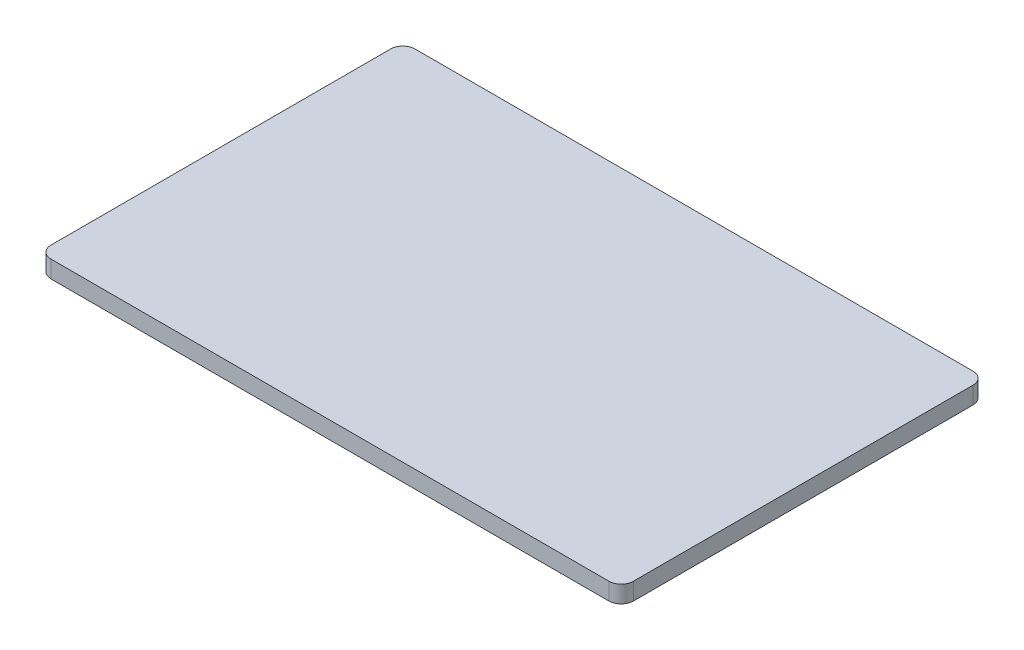
ISO-10303-21;
HEADER;
FILE_DESCRIPTION(('STEP AP214'),'2;1');
FILE_NAME('part.step','',(''),(''),'','','');
FILE_SCHEMA(('AUTOMOTIVE_DESIGN { 1 0 10303 214 1 1 1 1 }'));
ENDSEC;
DATA;
#1=APPLICATION_CONTEXT('core data for automotive mechanical design processes');
#2=APPLICATION_PROTOCOL_DEFINITION('international standard','automotive_design',2000,#1);
#3=PRODUCT_CONTEXT('',#1,'mechanical');
#4=PRODUCT('Part','Part','',(#3));
#5=PRODUCT_RELATED_PRODUCT_CATEGORY('part','',(#4));
#6=PRODUCT_DEFINITION_FORMATION('','',#4);
#7=PRODUCT_DEFINITION_CONTEXT('part definition',#1,'design');
#8=PRODUCT_DEFINITION('design','',#6,#7);
#9=PRODUCT_DEFINITION_SHAPE('','',#8);
#10=(LENGTH_UNIT() NAMED_UNIT(*) SI_UNIT(.MILLI.,.METRE.));
#11=(NAMED_UNIT(*) PLANE_ANGLE_UNIT() SI_UNIT($,.RADIAN.));
#12=(NAMED_UNIT(*) SI_UNIT($,.STERADIAN.) SOLID_ANGLE_UNIT());
#13=UNCERTAINTY_MEASURE_WITH_UNIT(LENGTH_MEASURE(1.E-05),#10,'distance_accuracy_value','');
#14=(GEOMETRIC_REPRESENTATION_CONTEXT(3) GLOBAL_UNCERTAINTY_ASSIGNED_CONTEXT((#13)) GLOBAL_UNIT_ASSIGNED_CONTEXT((#10,
#11,#12)) REPRESENTATION_CONTEXT('',''));
#15=CARTESIAN_POINT('',(0.,0.,0.));
#16=DIRECTION('',(0.,0.,1.));
#17=DIRECTION('',(1.,0.,0.));
#18=AXIS2_PLACEMENT_3D('',#15,#16,#17);
#19=CARTESIAN_POINT('',(152.4,13.589,95.25));
#20=DIRECTION('',(-1.,0.,0.));
#21=DIRECTION('',(0.,0.,1.));
#22=AXIS2_PLACEMENT_3D('',#19,#20,#21);
#23=PLANE('',#22);
#24=DIRECTION('',(0.,-1.,0.));
#25=VECTOR('',#24,1.);
#26=CARTESIAN_POINT('',(152.4,13.589,88.9));
#27=LINE('',#26,#25);
#28=CARTESIAN_POINT('',(152.4,13.589,88.9));
#29=VERTEX_POINT('',#28);
#30=CARTESIAN_POINT('',(152.4,4.59791348015412,88.9));
#31=VERTEX_POINT('',#30);
#32=EDGE_CURVE('E207',#29,#31,#27,.T.);
#33=ORIENTED_EDGE('',*,*,#32,.T.);
#34=CARTESIAN_POINT('',(152.4,31.2976699581272,95.25));
#35=DIRECTION('',(-1.,0.,0.));
#36=DIRECTION('',(0.,-0.311039060414623,-0.95039712904469));
#37=AXIS2_PLACEMENT_3D('',#34,#35,#36);
#38=ELLIPSE('',#37,36.8703327176572,25.4);
#39=CARTESIAN_POINT('',(152.4,4.57200000000002,87.3496078654686));
#40=VERTEX_POINT('',#39);
#41=EDGE_CURVE('E389',#31,#40,#38,.F.);
#42=ORIENTED_EDGE('',*,*,#41,.T.);
#43=DIRECTION('',(0.,0.,-1.));
#44=VECTOR('',#43,1.);
#45=CARTESIAN_POINT('',(152.4,4.57200000000002,-81.2799999999993));
#46=LINE('',#45,#44);
#47=CARTESIAN_POINT('',(152.4,4.57200000000002,-87.3496078654686));
#48=VERTEX_POINT('',#47);
#49=EDGE_CURVE('E379',#40,#48,#46,.T.);
#50=ORIENTED_EDGE('',*,*,#49,.T.);
#51=CARTESIAN_POINT('',(152.4,31.2976699581272,-95.2500000000001));
#52=DIRECTION('',(-1.,0.,0.));
#53=DIRECTION('',(0.,-0.311039060414623,0.95039712904469));
#54=AXIS2_PLACEMENT_3D('',#51,#52,#53);
#55=ELLIPSE('',#54,36.8703327176572,25.4);
#56=CARTESIAN_POINT('',(152.4,4.59791348015413,-88.9));
#57=VERTEX_POINT('',#56);
#58=EDGE_CURVE('E245',#48,#57,#55,.F.);
#59=ORIENTED_EDGE('',*,*,#58,.T.);
#60=DIRECTION('',(0.,-1.,0.));
#61=VECTOR('',#60,1.);
#62=CARTESIAN_POINT('',(152.4,13.589,-88.9));
#63=LINE('',#62,#61);
#64=CARTESIAN_POINT('',(152.4,13.589,-88.9));
#65=VERTEX_POINT('',#64);
#66=EDGE_CURVE('E210',#57,#65,#63,.F.);
#67=ORIENTED_EDGE('',*,*,#66,.T.);
#68=DIRECTION('',(0.,0.,-1.));
#69=VECTOR('',#68,1.);
#70=CARTESIAN_POINT('',(152.4,13.589,95.25));
#71=LINE('',#70,#69);
#72=EDGE_CURVE('E364',#29,#65,#71,.T.);
#73=ORIENTED_EDGE('',*,*,#72,.F.);
#74=EDGE_LOOP('',(#33,#42,#50,#59,#67,#73));
#75=FACE_BOUND('',#74,.T.);
#76=ADVANCED_FACE('F34',(#75),#23,.F.);
#77=CARTESIAN_POINT('',(-152.4,13.589,-95.25));
#78=DIRECTION('',(0.,0.,1.));
#79=DIRECTION('',(1.,0.,0.));
#80=AXIS2_PLACEMENT_3D('',#77,#78,#79);
#81=PLANE('',#80);
#82=DIRECTION('',(0.,-1.,0.));
#83=VECTOR('',#82,1.);
#84=CARTESIAN_POINT('',(146.05,13.589,-95.25));
#85=LINE('',#84,#83);
#86=CARTESIAN_POINT('',(146.05,13.589,-95.25));
#87=VERTEX_POINT('',#86);
#88=CARTESIAN_POINT('',(146.05,4.59791348015412,-95.25));
#89=VERTEX_POINT('',#88);
#90=EDGE_CURVE('E174',#87,#89,#85,.T.);
#91=ORIENTED_EDGE('',*,*,#90,.T.);
#92=CARTESIAN_POINT('',(152.4,31.2976699581272,-95.25));
#93=DIRECTION('',(0.,0.,1.));
#94=DIRECTION('',(-0.95039712904469,-0.311039060414623,0.));
#95=AXIS2_PLACEMENT_3D('',#92,#93,#94);
#96=ELLIPSE('',#95,36.8703327176572,25.4);
#97=CARTESIAN_POINT('',(144.499607865469,4.57200000000002,-95.25));
#98=VERTEX_POINT('',#97);
#99=EDGE_CURVE('E303',#89,#98,#96,.F.);
#100=ORIENTED_EDGE('',*,*,#99,.T.);
#101=DIRECTION('',(-1.,0.,0.));
#102=VECTOR('',#101,1.);
#103=CARTESIAN_POINT('',(-138.43,4.57200000000002,-95.25));
#104=LINE('',#103,#102);
#105=CARTESIAN_POINT('',(-144.499607865469,4.57200000000002,-95.25));
#106=VERTEX_POINT('',#105);
#107=EDGE_CURVE('E376',#98,#106,#104,.T.);
#108=ORIENTED_EDGE('',*,*,#107,.T.);
#109=CARTESIAN_POINT('',(-152.4,31.2976699581272,-95.25));
#110=DIRECTION('',(0.,0.,1.));
#111=DIRECTION('',(0.95039712904469,-0.311039060414623,0.));
#112=AXIS2_PLACEMENT_3D('',#109,#110,#111);
#113=ELLIPSE('',#112,36.8703327176572,25.4);
#114=CARTESIAN_POINT('',(-146.05,4.59791348015413,-95.25));
#115=VERTEX_POINT('',#114);
#116=EDGE_CURVE('E299',#106,#115,#113,.F.);
#117=ORIENTED_EDGE('',*,*,#116,.T.);
#118=DIRECTION('',(0.,-1.,0.));
#119=VECTOR('',#118,1.);
#120=CARTESIAN_POINT('',(-146.05,13.589,-95.25));
#121=LINE('',#120,#119);
#122=CARTESIAN_POINT('',(-146.05,13.589,-95.25));
#123=VERTEX_POINT('',#122);
#124=EDGE_CURVE('E205',#115,#123,#121,.F.);
#125=ORIENTED_EDGE('',*,*,#124,.T.);
#126=DIRECTION('',(-1.,0.,0.));
#127=VECTOR('',#126,1.);
#128=CARTESIAN_POINT('',(-152.4,13.589,-95.25));
#129=LINE('',#128,#127);
#130=EDGE_CURVE('E367',#87,#123,#129,.T.);
#131=ORIENTED_EDGE('',*,*,#130,.F.);
#132=EDGE_LOOP('',(#91,#100,#108,#117,#125,#131));
#133=FACE_BOUND('',#132,.T.);
#134=ADVANCED_FACE('F404',(#133),#81,.F.);
#135=CARTESIAN_POINT('',(-152.4,13.589,95.25));
#136=DIRECTION('',(1.,0.,0.));
#137=DIRECTION('',(0.,0.,-1.));
#138=AXIS2_PLACEMENT_3D('',#135,#136,#137);
#139=PLANE('',#138);
#140=DIRECTION('',(0.,-1.,0.));
#141=VECTOR('',#140,1.);
#142=CARTESIAN_POINT('',(-152.4,13.589,-88.9));
#143=LINE('',#142,#141);
#144=CARTESIAN_POINT('',(-152.4,13.589,-88.9));
#145=VERTEX_POINT('',#144);
#146=CARTESIAN_POINT('',(-152.4,4.59791348015412,-88.9));
#147=VERTEX_POINT('',#146);
#148=EDGE_CURVE('E189',#145,#147,#143,.T.);
#149=ORIENTED_EDGE('',*,*,#148,.T.);
#150=CARTESIAN_POINT('',(-152.4,31.2976699581272,-95.25));
#151=DIRECTION('',(1.,0.,0.));
#152=DIRECTION('',(0.,-0.311039060414623,0.95039712904469));
#153=AXIS2_PLACEMENT_3D('',#150,#151,#152);
#154=ELLIPSE('',#153,36.8703327176572,25.4);
#155=CARTESIAN_POINT('',(-152.4,4.57200000000002,-87.3496078654686));
#156=VERTEX_POINT('',#155);
#157=EDGE_CURVE('E44',#147,#156,#154,.F.);
#158=ORIENTED_EDGE('',*,*,#157,.T.);
#159=DIRECTION('',(0.,0.,1.));
#160=VECTOR('',#159,1.);
#161=CARTESIAN_POINT('',(-152.4,4.57200000000002,95.25));
#162=LINE('',#161,#160);
#163=CARTESIAN_POINT('',(-152.4,4.57200000000002,87.3496078654686));
#164=VERTEX_POINT('',#163);
#165=EDGE_CURVE('E185',#156,#164,#162,.T.);
#166=ORIENTED_EDGE('',*,*,#165,.T.);
#167=CARTESIAN_POINT('',(-152.4,31.2976699581272,95.25));
#168=DIRECTION('',(1.,0.,0.));
#169=DIRECTION('',(0.,0.311039060414623,0.95039712904469));
#170=AXIS2_PLACEMENT_3D('',#167,#168,#169);
#171=ELLIPSE('',#170,36.8703327176572,25.4);
#172=CARTESIAN_POINT('',(-152.4,4.59791348015412,88.9));
#173=VERTEX_POINT('',#172);
#174=EDGE_CURVE('E52',#164,#173,#171,.F.);
#175=ORIENTED_EDGE('',*,*,#174,.T.);
#176=DIRECTION('',(0.,-1.,0.));
#177=VECTOR('',#176,1.);
#178=CARTESIAN_POINT('',(-152.4,13.589,88.9));
#179=LINE('',#178,#177);
#180=CARTESIAN_POINT('',(-152.4,13.589,88.9));
#181=VERTEX_POINT('',#180);
#182=EDGE_CURVE('E191',#173,#181,#179,.F.);
#183=ORIENTED_EDGE('',*,*,#182,.T.);
#184=DIRECTION('',(0.,0.,1.));
#185=VECTOR('',#184,1.);
#186=CARTESIAN_POINT('',(-152.4,13.589,95.25));
#187=LINE('',#186,#185);
#188=EDGE_CURVE('E171',#145,#181,#187,.T.);
#189=ORIENTED_EDGE('',*,*,#188,.F.);
#190=EDGE_LOOP('',(#149,#158,#166,#175,#183,#189));
#191=FACE_BOUND('',#190,.T.);
#192=ADVANCED_FACE('F441',(#191),#139,.F.);
#193=CARTESIAN_POINT('',(-152.4,13.589,95.25));
#194=DIRECTION('',(0.,0.,-1.));
#195=DIRECTION('',(-1.,0.,0.));
#196=AXIS2_PLACEMENT_3D('',#193,#194,#195);
#197=PLANE('',#196);
#198=DIRECTION('',(1.,0.,0.));
#199=VECTOR('',#198,1.);
#200=CARTESIAN_POINT('',(138.429999999998,4.57200000000002,95.25));
#201=LINE('',#200,#199);
#202=CARTESIAN_POINT('',(-144.499607865469,4.57200000000002,95.25));
#203=VERTEX_POINT('',#202);
#204=CARTESIAN_POINT('',(144.499607865469,4.57200000000002,95.25));
#205=VERTEX_POINT('',#204);
#206=EDGE_CURVE('E193',#203,#205,#201,.T.);
#207=ORIENTED_EDGE('',*,*,#206,.T.);
#208=CARTESIAN_POINT('',(152.4,31.2976699581272,95.25));
#209=DIRECTION('',(0.,0.,-1.));
#210=DIRECTION('',(-0.95039712904469,-0.311039060414623,0.));
#211=AXIS2_PLACEMENT_3D('',#208,#209,#210);
#212=ELLIPSE('',#211,36.8703327176572,25.4);
#213=CARTESIAN_POINT('',(146.05,4.59791348015413,95.25));
#214=VERTEX_POINT('',#213);
#215=EDGE_CURVE('E236',#205,#214,#212,.F.);
#216=ORIENTED_EDGE('',*,*,#215,.T.);
#217=DIRECTION('',(0.,-1.,0.));
#218=VECTOR('',#217,1.);
#219=CARTESIAN_POINT('',(146.05,13.589,95.25));
#220=LINE('',#219,#218);
#221=CARTESIAN_POINT('',(146.05,13.589,95.25));
#222=VERTEX_POINT('',#221);
#223=EDGE_CURVE('E184',#214,#222,#220,.F.);
#224=ORIENTED_EDGE('',*,*,#223,.T.);
#225=DIRECTION('',(1.,0.,0.));
#226=VECTOR('',#225,1.);
#227=CARTESIAN_POINT('',(-152.4,13.589,95.25));
#228=LINE('',#227,#226);
#229=CARTESIAN_POINT('',(-146.05,13.589,95.25));
#230=VERTEX_POINT('',#229);
#231=EDGE_CURVE('E168',#230,#222,#228,.T.);
#232=ORIENTED_EDGE('',*,*,#231,.F.);
#233=DIRECTION('',(0.,-1.,0.));
#234=VECTOR('',#233,1.);
#235=CARTESIAN_POINT('',(-146.05,13.589,95.25));
#236=LINE('',#235,#234);
#237=CARTESIAN_POINT('',(-146.05,4.59791348015413,95.25));
#238=VERTEX_POINT('',#237);
#239=EDGE_CURVE('E181',#230,#238,#236,.T.);
#240=ORIENTED_EDGE('',*,*,#239,.T.);
#241=CARTESIAN_POINT('',(-152.4,31.2976699581272,95.25));
#242=DIRECTION('',(0.,0.,-1.));
#243=DIRECTION('',(-0.95039712904469,0.311039060414623,0.));
#244=AXIS2_PLACEMENT_3D('',#241,#242,#243);
#245=ELLIPSE('',#244,36.8703327176572,25.4);
#246=EDGE_CURVE('E234',#238,#203,#245,.F.);
#247=ORIENTED_EDGE('',*,*,#246,.T.);
#248=EDGE_LOOP('',(#207,#216,#224,#232,#240,#247));
#249=FACE_BOUND('',#248,.T.);
#250=ADVANCED_FACE('F180',(#249),#197,.F.);
#251=CARTESIAN_POINT('',(0.,13.589,0.));
#252=DIRECTION('',(0.,-1.,0.));
#253=DIRECTION('',(0.,0.,-1.));
#254=AXIS2_PLACEMENT_3D('',#251,#252,#253);
#255=PLANE('',#254);
#256=ORIENTED_EDGE('',*,*,#188,.T.);
#257=CARTESIAN_POINT('',(-146.05,13.589,88.9));
#258=DIRECTION('',(0.,-1.,0.));
#259=DIRECTION('',(0.,0.,-1.));
#260=AXIS2_PLACEMENT_3D('',#257,#258,#259);
#261=CIRCLE('',#260,6.35);
#262=EDGE_CURVE('E165',#181,#230,#261,.F.);
#263=ORIENTED_EDGE('',*,*,#262,.T.);
#264=ORIENTED_EDGE('',*,*,#231,.T.);
#265=CARTESIAN_POINT('',(146.05,13.589,88.9));
#266=DIRECTION('',(0.,-1.,0.));
#267=DIRECTION('',(0.,0.,-1.));
#268=AXIS2_PLACEMENT_3D('',#265,#266,#267);
#269=CIRCLE('',#268,6.35);
#270=EDGE_CURVE('E198',#222,#29,#269,.F.);
#271=ORIENTED_EDGE('',*,*,#270,.T.);
#272=ORIENTED_EDGE('',*,*,#72,.T.);
#273=CARTESIAN_POINT('',(146.05,13.589,-88.9));
#274=DIRECTION('',(0.,-1.,0.));
#275=DIRECTION('',(0.,0.,-1.));
#276=AXIS2_PLACEMENT_3D('',#273,#274,#275);
#277=CIRCLE('',#276,6.35);
#278=EDGE_CURVE('E200',#65,#87,#277,.F.);
#279=ORIENTED_EDGE('',*,*,#278,.T.);
#280=ORIENTED_EDGE('',*,*,#130,.T.);
#281=CARTESIAN_POINT('',(-146.05,13.589,-88.9));
#282=DIRECTION('',(0.,-1.,0.));
#283=DIRECTION('',(0.,0.,-1.));
#284=AXIS2_PLACEMENT_3D('',#281,#282,#283);
#285=CIRCLE('',#284,6.35);
#286=EDGE_CURVE('E175',#123,#145,#285,.F.);
#287=ORIENTED_EDGE('',*,*,#286,.T.);
#288=EDGE_LOOP('',(#256,#263,#264,#271,#272,#279,#280,#287));
#289=FACE_BOUND('',#288,.T.);
#290=ADVANCED_FACE('F167',(#289),#255,.F.);
#291=CARTESIAN_POINT('',(0.,0.,0.));
#292=DIRECTION('',(0.,-1.,0.));
#293=DIRECTION('',(0.,0.,-1.));
#294=AXIS2_PLACEMENT_3D('',#291,#292,#293);
#295=PLANE('',#294);
#296=DIRECTION('',(0.,0.,1.));
#297=VECTOR('',#296,1.);
#298=CARTESIAN_POINT('',(134.379341794611,0.,0.));
#299=LINE('',#298,#297);
#300=CARTESIAN_POINT('',(134.379341794611,0.,-77.2293417946111));
#301=VERTEX_POINT('',#300);
#302=CARTESIAN_POINT('',(134.379341794611,0.,77.2293417946111));
#303=VERTEX_POINT('',#302);
#304=EDGE_CURVE('E216',#301,#303,#299,.T.);
#305=ORIENTED_EDGE('',*,*,#304,.T.);
#306=DIRECTION('',(-1.,0.,0.));
#307=VECTOR('',#306,1.);
#308=CARTESIAN_POINT('',(0.,0.,77.2293417946111));
#309=LINE('',#308,#307);
#310=CARTESIAN_POINT('',(-134.379341794611,0.,77.2293417946111));
#311=VERTEX_POINT('',#310);
#312=EDGE_CURVE('E218',#303,#311,#309,.T.);
#313=ORIENTED_EDGE('',*,*,#312,.T.);
#314=DIRECTION('',(0.,0.,-1.));
#315=VECTOR('',#314,1.);
#316=CARTESIAN_POINT('',(-134.379341794611,0.,0.));
#317=LINE('',#316,#315);
#318=CARTESIAN_POINT('',(-134.379341794611,0.,-77.2293417946111));
#319=VERTEX_POINT('',#318);
#320=EDGE_CURVE('E212',#311,#319,#317,.T.);
#321=ORIENTED_EDGE('',*,*,#320,.T.);
#322=DIRECTION('',(1.,0.,0.));
#323=VECTOR('',#322,1.);
#324=CARTESIAN_POINT('',(0.,0.,-77.2293417946111));
#325=LINE('',#324,#323);
#326=EDGE_CURVE('E214',#319,#301,#325,.T.);
#327=ORIENTED_EDGE('',*,*,#326,.T.);
#328=EDGE_LOOP('',(#305,#313,#321,#327));
#329=FACE_BOUND('',#328,.T.);
#330=ADVANCED_FACE('F426',(#329),#295,.T.);
#331=CARTESIAN_POINT('',(-152.4,4.57200000000002,95.25));
#332=DIRECTION('',(-0.311039060414623,-0.95039712904469,0.));
#333=DIRECTION('',(0.,0.,-1.));
#334=AXIS2_PLACEMENT_3D('',#331,#332,#333);
#335=PLANE('',#334);
#336=ORIENTED_EDGE('',*,*,#165,.F.);
#337=DIRECTION('',(0.688900753744377,-0.225458428498157,0.688900753744377));
#338=VECTOR('',#337,1.);
#339=CARTESIAN_POINT('',(-65.7411023230243,-23.7890937851917,-0.690710188492899));
#340=LINE('',#339,#338);
#341=CARTESIAN_POINT('',(-142.279733929143,1.25991292226488,-77.2293417946111));
#342=VERTEX_POINT('',#341);
#343=EDGE_CURVE('E279',#156,#342,#340,.T.);
#344=ORIENTED_EDGE('',*,*,#343,.T.);
#345=DIRECTION('',(0.,0.,-1.));
#346=VECTOR('',#345,1.);
#347=CARTESIAN_POINT('',(-142.279733929143,1.25991292226488,95.25));
#348=LINE('',#347,#346);
#349=CARTESIAN_POINT('',(-142.279733929143,1.25991292226488,77.2293417946111));
#350=VERTEX_POINT('',#349);
#351=EDGE_CURVE('E306',#342,#350,#348,.F.);
#352=ORIENTED_EDGE('',*,*,#351,.T.);
#353=DIRECTION('',(-0.688900753744377,0.225458428498157,0.688900753744377));
#354=VECTOR('',#353,1.);
#355=CARTESIAN_POINT('',(-156.149401664097,5.7990769082501,91.0990095295661));
#356=LINE('',#355,#354);
#357=EDGE_CURVE('E305',#350,#164,#356,.T.);
#358=ORIENTED_EDGE('',*,*,#357,.T.);
#359=EDGE_LOOP('',(#336,#344,#352,#358));
#360=FACE_BOUND('',#359,.T.);
#361=ADVANCED_FACE('F313',(#360),#335,.T.);
#362=CARTESIAN_POINT('',(-152.4,4.57200000000002,-95.25));
#363=DIRECTION('',(0.,-0.95039712904469,-0.311039060414623));
#364=DIRECTION('',(1.,0.,0.));
#365=AXIS2_PLACEMENT_3D('',#362,#363,#364);
#366=PLANE('',#365);
#367=ORIENTED_EDGE('',*,*,#107,.F.);
#368=DIRECTION('',(-0.688900753744377,-0.225458428498157,0.688900753744377));
#369=VECTOR('',#368,1.);
#370=CARTESIAN_POINT('',(3.59573058384902,-41.5419962012568,45.6538772816196));
#371=LINE('',#370,#369);
#372=CARTESIAN_POINT('',(134.379341794611,1.25991292226488,-85.1297339291426));
#373=VERTEX_POINT('',#372);
#374=EDGE_CURVE('E300',#98,#373,#371,.T.);
#375=ORIENTED_EDGE('',*,*,#374,.T.);
#376=DIRECTION('',(1.,0.,0.));
#377=VECTOR('',#376,1.);
#378=CARTESIAN_POINT('',(-152.4,1.25991292226488,-85.1297339291426));
#379=LINE('',#378,#377);
#380=CARTESIAN_POINT('',(-134.379341794611,1.25991292226488,-85.1297339291426));
#381=VERTEX_POINT('',#380);
#382=EDGE_CURVE('E409',#373,#381,#379,.F.);
#383=ORIENTED_EDGE('',*,*,#382,.T.);
#384=DIRECTION('',(0.688900753744377,-0.225458428498157,0.688900753744377));
#385=VECTOR('',#384,1.);
#386=CARTESIAN_POINT('',(-148.249009529566,5.7990769082501,-98.9994016640975));
#387=LINE('',#386,#385);
#388=EDGE_CURVE('E320',#381,#106,#387,.F.);
#389=ORIENTED_EDGE('',*,*,#388,.T.);
#390=EDGE_LOOP('',(#367,#375,#383,#389));
#391=FACE_BOUND('',#390,.T.);
#392=ADVANCED_FACE('F407',(#391),#366,.T.);
#393=CARTESIAN_POINT('',(152.4,4.57200000000002,95.25));
#394=DIRECTION('',(0.311039060414623,-0.95039712904469,0.));
#395=DIRECTION('',(0.,0.,1.));
#396=AXIS2_PLACEMENT_3D('',#393,#394,#395);
#397=PLANE('',#396);
#398=ORIENTED_EDGE('',*,*,#49,.F.);
#399=DIRECTION('',(-0.688900753744377,-0.225458428498157,-0.688900753744377));
#400=VECTOR('',#399,1.);
#401=CARTESIAN_POINT('',(156.149401664098,5.7990769082501,91.0990095295661));
#402=LINE('',#401,#400);
#403=CARTESIAN_POINT('',(142.279733929143,1.25991292226488,77.2293417946111));
#404=VERTEX_POINT('',#403);
#405=EDGE_CURVE('E232',#40,#404,#402,.T.);
#406=ORIENTED_EDGE('',*,*,#405,.T.);
#407=DIRECTION('',(0.,0.,1.));
#408=VECTOR('',#407,1.);
#409=CARTESIAN_POINT('',(142.279733929143,1.25991292226488,95.25));
#410=LINE('',#409,#408);
#411=CARTESIAN_POINT('',(142.279733929143,1.25991292226488,-77.2293417946112));
#412=VERTEX_POINT('',#411);
#413=EDGE_CURVE('E230',#404,#412,#410,.F.);
#414=ORIENTED_EDGE('',*,*,#413,.T.);
#415=DIRECTION('',(-0.688900753744377,-0.225458428498157,0.688900753744377));
#416=VECTOR('',#415,1.);
#417=CARTESIAN_POINT('',(65.7411023230243,-23.7890937851917,-0.690710188492927));
#418=LINE('',#417,#416);
#419=EDGE_CURVE('E228',#412,#48,#418,.F.);
#420=ORIENTED_EDGE('',*,*,#419,.T.);
#421=EDGE_LOOP('',(#398,#406,#414,#420));
#422=FACE_BOUND('',#421,.T.);
#423=ADVANCED_FACE('F414',(#422),#397,.T.);
#424=CARTESIAN_POINT('',(-152.4,4.57200000000002,95.25));
#425=DIRECTION('',(0.,-0.95039712904469,0.311039060414623));
#426=DIRECTION('',(-1.,0.,0.));
#427=AXIS2_PLACEMENT_3D('',#424,#425,#426);
#428=PLANE('',#427);
#429=DIRECTION('',(-1.,0.,0.));
#430=VECTOR('',#429,1.);
#431=CARTESIAN_POINT('',(-152.4,1.25991292226488,85.1297339291425));
#432=LINE('',#431,#430);
#433=CARTESIAN_POINT('',(-134.379341794611,1.25991292226488,85.1297339291425));
#434=VERTEX_POINT('',#433);
#435=CARTESIAN_POINT('',(134.379341794611,1.25991292226488,85.1297339291425));
#436=VERTEX_POINT('',#435);
#437=EDGE_CURVE('E223',#434,#436,#432,.F.);
#438=ORIENTED_EDGE('',*,*,#437,.T.);
#439=DIRECTION('',(-0.688900753744377,-0.225458428498157,-0.688900753744377));
#440=VECTOR('',#439,1.);
#441=CARTESIAN_POINT('',(3.59573058384902,-41.5419962012568,-45.6538772816197));
#442=LINE('',#441,#440);
#443=EDGE_CURVE('E226',#436,#205,#442,.F.);
#444=ORIENTED_EDGE('',*,*,#443,.T.);
#445=ORIENTED_EDGE('',*,*,#206,.F.);
#446=DIRECTION('',(-0.688900753744377,0.225458428498157,0.688900753744377));
#447=VECTOR('',#446,1.);
#448=CARTESIAN_POINT('',(-148.249009529566,5.7990769082501,98.9994016640975));
#449=LINE('',#448,#447);
#450=EDGE_CURVE('E221',#203,#434,#449,.F.);
#451=ORIENTED_EDGE('',*,*,#450,.T.);
#452=EDGE_LOOP('',(#438,#444,#445,#451));
#453=FACE_BOUND('',#452,.T.);
#454=ADVANCED_FACE('F448',(#453),#428,.T.);
#455=CARTESIAN_POINT('',(-146.05,13.589,88.9));
#456=DIRECTION('',(0.,-1.,0.));
#457=DIRECTION('',(0.,0.,-1.));
#458=AXIS2_PLACEMENT_3D('',#455,#456,#457);
#459=CYLINDRICAL_SURFACE('',#458,6.35);
#460=ORIENTED_EDGE('',*,*,#182,.F.);
#461=CARTESIAN_POINT('',(-152.4,4.59791348015412,88.9));
#462=CARTESIAN_POINT('',(-152.400020667105,4.6038378116469,89.0780381119973));
#463=CARTESIAN_POINT('',(-152.392513259242,4.60857042537825,89.2561080687323));
#464=CARTESIAN_POINT('',(-152.36257472654,4.61609963305788,89.6110133332933));
#465=CARTESIAN_POINT('',(-152.340145102884,4.61889642169348,89.7878487635053));
#466=CARTESIAN_POINT('',(-152.280520754029,4.62300060095804,90.1388685401605));
#467=CARTESIAN_POINT('',(-152.243339031985,4.6243092993391,90.3130550814302));
#468=CARTESIAN_POINT('',(-152.154479657078,4.6258662838433,90.6576949072788));
#469=CARTESIAN_POINT('',(-152.102801980412,4.62611456822518,90.8281481857269));
#470=CARTESIAN_POINT('',(-151.985308488086,4.62594009870275,91.1641313130452));
#471=CARTESIAN_POINT('',(-151.919491061551,4.62551726830638,91.3296605984999));
#472=CARTESIAN_POINT('',(-151.77416083166,4.62434163904294,91.6546653734145));
#473=CARTESIAN_POINT('',(-151.694643005533,4.62358871900317,91.8141386163785));
#474=CARTESIAN_POINT('',(-151.522519666325,4.62203645955461,92.1257876153477));
#475=CARTESIAN_POINT('',(-151.42991859448,4.62123713595198,92.277965824342));
#476=CARTESIAN_POINT('',(-151.232260222904,4.61980804309318,92.5740111062502));
#477=CARTESIAN_POINT('',(-151.127202651538,4.6191782775355,92.7178779978198));
#478=CARTESIAN_POINT('',(-150.905058682717,4.61823025718538,92.9966772672473));
#479=CARTESIAN_POINT('',(-150.787938881112,4.61791289463367,93.1315830342392));
#480=CARTESIAN_POINT('',(-150.542752232607,4.61765949486312,93.3910508319224));
#481=CARTESIAN_POINT('',(-150.414685359187,4.61772345856802,93.5156128375559));
#482=CARTESIAN_POINT('',(-150.148486458267,4.61821959586221,93.753532994551));
#483=CARTESIAN_POINT('',(-150.010352246557,4.61865184957443,93.8668887019497));
#484=CARTESIAN_POINT('',(-149.725028943805,4.61979197677271,94.0815571927602));
#485=CARTESIAN_POINT('',(-149.577840033461,4.62049984476006,94.1828702163804));
#486=CARTESIAN_POINT('',(-149.275411571953,4.62202182493222,94.3727605301459));
#487=CARTESIAN_POINT('',(-149.12016996685,4.62283596430397,94.4613345490985));
#488=CARTESIAN_POINT('',(-148.80283430029,4.62432829799911,94.6250564288504));
#489=CARTESIAN_POINT('',(-148.640742752638,4.62500654167805,94.700209163005));
#490=CARTESIAN_POINT('',(-148.310849457928,4.62592073110877,94.8365728930242));
#491=CARTESIAN_POINT('',(-148.143049546625,4.62615681771026,94.8977883231744));
#492=CARTESIAN_POINT('',(-147.802957827396,4.62582542383646,95.0058568827309));
#493=CARTESIAN_POINT('',(-147.630667099986,4.62525813493768,95.052713432979));
#494=CARTESIAN_POINT('',(-147.225959506266,4.62253133510744,95.1446393834411));
#495=CARTESIAN_POINT('',(-146.992244994369,4.61991321047202,95.1841507170288));
#496=CARTESIAN_POINT('',(-146.639783647139,4.61362727081899,95.2236577416255));
#497=CARTESIAN_POINT('',(-146.522032325515,4.61114039806078,95.2335334151686));
#498=CARTESIAN_POINT('',(-146.286191780479,4.60524860765528,95.246703909776));
#499=CARTESIAN_POINT('',(-146.168102576186,4.60184374097735,95.2499990961204));
#500=CARTESIAN_POINT('',(-146.05,4.59791348015413,95.25));
#501=B_SPLINE_CURVE_WITH_KNOTS('',3,(#461,#462,#463,#464,#465,#466,#467,#468,#469,#470,#471,
#472,#473,#474,#475,#476,#477,#478,#479,#480,#481,#482,#483,#484,#485,#486,#487,#488,#489,#490,
#491,#492,#493,#494,#495,#496,#497,#498,#499,#500),.UNSPECIFIED.,.F.,.F.,(4,2,2,2,2,2,2,2,2,2,2,
2,2,2,2,2,2,2,2,4),(0.,0.534236687646788,1.06841963891569,1.6021327799044,2.13584679727667,
2.66962165044909,3.20359261144624,3.73738274435068,4.27118451960223,4.80650647757356,
5.34182973232971,5.877269478482,6.41269854273779,6.94826485290861,7.48363629833925,
8.01883717149302,8.55391043975106,9.26334690967573,9.61776235539707,9.97215812711578),.UNSPECIFIED.);
#502=EDGE_CURVE('E11',#173,#238,#501,.T.);
#503=ORIENTED_EDGE('',*,*,#502,.T.);
#504=ORIENTED_EDGE('',*,*,#239,.F.);
#505=ORIENTED_EDGE('',*,*,#262,.F.);
#506=EDGE_LOOP('',(#460,#503,#504,#505));
#507=FACE_BOUND('',#506,.T.);
#508=ADVANCED_FACE('F187',(#507),#459,.T.);
#509=CARTESIAN_POINT('',(-146.05,13.589,-88.9));
#510=DIRECTION('',(0.,-1.,0.));
#511=DIRECTION('',(0.,0.,-1.));
#512=AXIS2_PLACEMENT_3D('',#509,#510,#511);
#513=CYLINDRICAL_SURFACE('',#512,6.35);
#514=ORIENTED_EDGE('',*,*,#124,.F.);
#515=CARTESIAN_POINT('',(-146.05,4.59791348015413,-95.25));
#516=CARTESIAN_POINT('',(-146.228038111997,4.60383781164691,-95.2500206671048));
#517=CARTESIAN_POINT('',(-146.406108068732,4.60857042537826,-95.2425132592419));
#518=CARTESIAN_POINT('',(-146.761013333293,4.61609963305788,-95.2125747265401));
#519=CARTESIAN_POINT('',(-146.937848763505,4.61889642169348,-95.1901451028841));
#520=CARTESIAN_POINT('',(-147.28886854016,4.62300060095804,-95.1305207540287));
#521=CARTESIAN_POINT('',(-147.46305508143,4.6243092993391,-95.0933390319853));
#522=CARTESIAN_POINT('',(-147.807694907279,4.6258662838433,-95.0044796570785));
#523=CARTESIAN_POINT('',(-147.978148185727,4.62611456822518,-94.9528019804123));
#524=CARTESIAN_POINT('',(-148.314131313045,4.62594009870275,-94.8353084880864));
#525=CARTESIAN_POINT('',(-148.4796605985,4.62551726830639,-94.7694910615514));
#526=CARTESIAN_POINT('',(-148.804665373415,4.62434163904294,-94.6241608316598));
#527=CARTESIAN_POINT('',(-148.964138616379,4.62358871900317,-94.5446430055328));
#528=CARTESIAN_POINT('',(-149.275787615348,4.62203645955461,-94.3725196663252));
#529=CARTESIAN_POINT('',(-149.427965824342,4.62123713595198,-94.2799185944803));
#530=CARTESIAN_POINT('',(-149.72401110625,4.61980804309319,-94.0822602229044));
#531=CARTESIAN_POINT('',(-149.86787799782,4.6191782775355,-93.9772026515381));
#532=CARTESIAN_POINT('',(-150.146677267247,4.61823025718538,-93.7550586827168));
#533=CARTESIAN_POINT('',(-150.281583034239,4.61791289463367,-93.6379388811124));
#534=CARTESIAN_POINT('',(-150.541050831922,4.61765949486312,-93.3927522326066));
#535=CARTESIAN_POINT('',(-150.665612837556,4.61772345856802,-93.2646853591874));
#536=CARTESIAN_POINT('',(-150.903532994551,4.61821959586222,-92.9984864582668));
#537=CARTESIAN_POINT('',(-151.01688870195,4.61865184957444,-92.8603522465573));
#538=CARTESIAN_POINT('',(-151.23155719276,4.61979197677272,-92.5750289438055));
#539=CARTESIAN_POINT('',(-151.33287021638,4.62049984476006,-92.4278400334608));
#540=CARTESIAN_POINT('',(-151.522760530146,4.62202182493222,-92.1254115719532));
#541=CARTESIAN_POINT('',(-151.611334549098,4.62283596430397,-91.9701699668498));
#542=CARTESIAN_POINT('',(-151.77505642885,4.62432829799911,-91.6528343002899));
#543=CARTESIAN_POINT('',(-151.850209163005,4.62500654167805,-91.4907427526379));
#544=CARTESIAN_POINT('',(-151.986572893024,4.62592073110877,-91.160849457928));
#545=CARTESIAN_POINT('',(-152.047788323174,4.62615681771025,-90.9930495466248));
#546=CARTESIAN_POINT('',(-152.155856882731,4.62582542383646,-90.6529578273957));
#547=CARTESIAN_POINT('',(-152.202713432979,4.62525813493768,-90.4806670999858));
#548=CARTESIAN_POINT('',(-152.294639383441,4.62253133510744,-90.0759595062661));
#549=CARTESIAN_POINT('',(-152.334150717029,4.61991321047202,-89.8422449943689));
#550=CARTESIAN_POINT('',(-152.373657741625,4.61362727081899,-89.4897836471393));
#551=CARTESIAN_POINT('',(-152.383533415169,4.61114039806079,-89.3720323255154));
#552=CARTESIAN_POINT('',(-152.396703909776,4.60524860765528,-89.1361917804789));
#553=CARTESIAN_POINT('',(-152.39999909612,4.60184374097736,-89.0181025761863));
#554=CARTESIAN_POINT('',(-152.4,4.59791348015413,-88.9));
#555=B_SPLINE_CURVE_WITH_KNOTS('',3,(#515,#516,#517,#518,#519,#520,#521,#522,#523,#524,#525,
#526,#527,#528,#529,#530,#531,#532,#533,#534,#535,#536,#537,#538,#539,#540,#541,#542,#543,#544,
#545,#546,#547,#548,#549,#550,#551,#552,#553,#554),.UNSPECIFIED.,.F.,.F.,(4,2,2,2,2,2,2,2,2,2,2,
2,2,2,2,2,2,2,2,4),(0.,0.534236687646802,1.06841963891568,1.6021327799044,2.13584679727669,
2.66962165044911,3.20359261144626,3.73738274435067,4.27118451960226,4.80650647757354,
5.34182973232972,5.87726947848203,6.41269854273781,6.94826485290862,7.48363629833927,
8.01883717149301,8.55391043975108,9.26334690967581,9.61776235539709,9.97215812711576),.UNSPECIFIED.);
#556=EDGE_CURVE('E60',#115,#147,#555,.T.);
#557=ORIENTED_EDGE('',*,*,#556,.T.);
#558=ORIENTED_EDGE('',*,*,#148,.F.);
#559=ORIENTED_EDGE('',*,*,#286,.F.);
#560=EDGE_LOOP('',(#514,#557,#558,#559));
#561=FACE_BOUND('',#560,.T.);
#562=ADVANCED_FACE('F282',(#561),#513,.T.);
#563=CARTESIAN_POINT('',(146.05,13.589,-88.9));
#564=DIRECTION('',(0.,-1.,0.));
#565=DIRECTION('',(0.,0.,-1.));
#566=AXIS2_PLACEMENT_3D('',#563,#564,#565);
#567=CYLINDRICAL_SURFACE('',#566,6.35);
#568=ORIENTED_EDGE('',*,*,#66,.F.);
#569=CARTESIAN_POINT('',(152.4,4.59791348015413,-88.9));
#570=CARTESIAN_POINT('',(152.400020667105,4.6038378116469,-89.0780381119973));
#571=CARTESIAN_POINT('',(152.392513259242,4.60857042537825,-89.2561080687323));
#572=CARTESIAN_POINT('',(152.36257472654,4.61609963305787,-89.6110133332934));
#573=CARTESIAN_POINT('',(152.340145102884,4.61889642169347,-89.7878487635053));
#574=CARTESIAN_POINT('',(152.280520754029,4.62300060095803,-90.1388685401605));
#575=CARTESIAN_POINT('',(152.243339031985,4.62430929933909,-90.3130550814303));
#576=CARTESIAN_POINT('',(152.154479657079,4.62586628384329,-90.6576949072789));
#577=CARTESIAN_POINT('',(152.102801980412,4.62611456822517,-90.8281481857269));
#578=CARTESIAN_POINT('',(151.985308488086,4.62594009870274,-91.1641313130453));
#579=CARTESIAN_POINT('',(151.919491061551,4.62551726830638,-91.3296605985));
#580=CARTESIAN_POINT('',(151.77416083166,4.62434163904293,-91.6546653734146));
#581=CARTESIAN_POINT('',(151.694643005533,4.62358871900316,-91.8141386163786));
#582=CARTESIAN_POINT('',(151.522519666325,4.62203645955459,-92.1257876153477));
#583=CARTESIAN_POINT('',(151.42991859448,4.62123713595197,-92.2779658243421));
#584=CARTESIAN_POINT('',(151.232260222904,4.61980804309318,-92.5740111062503));
#585=CARTESIAN_POINT('',(151.127202651538,4.61917827753549,-92.7178779978199));
#586=CARTESIAN_POINT('',(150.905058682717,4.61823025718536,-92.9966772672474));
#587=CARTESIAN_POINT('',(150.787938881112,4.61791289463365,-93.1315830342393));
#588=CARTESIAN_POINT('',(150.542752232607,4.61765949486312,-93.3910508319225));
#589=CARTESIAN_POINT('',(150.414685359187,4.61772345856802,-93.5156128375559));
#590=CARTESIAN_POINT('',(150.148486458267,4.61821959586221,-93.753532994551));
#591=CARTESIAN_POINT('',(150.010352246557,4.61865184957442,-93.8668887019497));
#592=CARTESIAN_POINT('',(149.725028943805,4.6197919767727,-94.0815571927602));
#593=CARTESIAN_POINT('',(149.577840033461,4.62049984476005,-94.1828702163805));
#594=CARTESIAN_POINT('',(149.275411571953,4.62202182493221,-94.3727605301459));
#595=CARTESIAN_POINT('',(149.12016996685,4.62283596430397,-94.4613345490985));
#596=CARTESIAN_POINT('',(148.80283430029,4.6243282979991,-94.6250564288505));
#597=CARTESIAN_POINT('',(148.640742752638,4.62500654167804,-94.700209163005));
#598=CARTESIAN_POINT('',(148.310849457928,4.62592073110876,-94.8365728930242));
#599=CARTESIAN_POINT('',(148.143049546625,4.62615681771024,-94.8977883231744));
#600=CARTESIAN_POINT('',(147.802957827396,4.62582542383645,-95.005856882731));
#601=CARTESIAN_POINT('',(147.630667099986,4.62525813493767,-95.052713432979));
#602=CARTESIAN_POINT('',(147.225959506266,4.62253133510744,-95.1446393834412));
#603=CARTESIAN_POINT('',(146.992244994369,4.61991321047201,-95.1841507170288));
#604=CARTESIAN_POINT('',(146.639783647139,4.61362727081899,-95.2236577416255));
#605=CARTESIAN_POINT('',(146.522032325515,4.61114039806078,-95.2335334151687));
#606=CARTESIAN_POINT('',(146.286191780479,4.60524860765527,-95.2467039097761));
#607=CARTESIAN_POINT('',(146.168102576186,4.60184374097735,-95.2499990961204));
#608=CARTESIAN_POINT('',(146.05,4.59791348015412,-95.25));
#609=B_SPLINE_CURVE_WITH_KNOTS('',3,(#569,#570,#571,#572,#573,#574,#575,#576,#577,#578,#579,
#580,#581,#582,#583,#584,#585,#586,#587,#588,#589,#590,#591,#592,#593,#594,#595,#596,#597,#598,
#599,#600,#601,#602,#603,#604,#605,#606,#607,#608),.UNSPECIFIED.,.F.,.F.,(4,2,2,2,2,2,2,2,2,2,2,
2,2,2,2,2,2,2,2,4),(0.,0.534236687646775,1.06841963891569,1.60213277990441,2.13584679727667,
2.66962165044911,3.20359261144625,3.73738274435069,4.27118451960223,4.80650647757352,
5.34182973232968,5.87726947848196,6.41269854273779,6.94826485290858,7.48363629833925,
8.01883717149299,8.55391043975106,9.26334690967579,9.6177623553971,9.97215812711578),.UNSPECIFIED.);
#610=EDGE_CURVE('E293',#57,#89,#609,.T.);
#611=ORIENTED_EDGE('',*,*,#610,.T.);
#612=ORIENTED_EDGE('',*,*,#90,.F.);
#613=ORIENTED_EDGE('',*,*,#278,.F.);
#614=EDGE_LOOP('',(#568,#611,#612,#613));
#615=FACE_BOUND('',#614,.T.);
#616=ADVANCED_FACE('F286',(#615),#567,.T.);
#617=CARTESIAN_POINT('',(146.05,13.589,88.9));
#618=DIRECTION('',(0.,-1.,0.));
#619=DIRECTION('',(0.,0.,-1.));
#620=AXIS2_PLACEMENT_3D('',#617,#618,#619);
#621=CYLINDRICAL_SURFACE('',#620,6.35);
#622=ORIENTED_EDGE('',*,*,#223,.F.);
#623=CARTESIAN_POINT('',(146.05,4.59791348015413,95.25));
#624=CARTESIAN_POINT('',(146.228038111997,4.6038378116469,95.2500206671048));
#625=CARTESIAN_POINT('',(146.406108068732,4.60857042537825,95.2425132592419));
#626=CARTESIAN_POINT('',(146.761013333293,4.61609963305787,95.21257472654));
#627=CARTESIAN_POINT('',(146.937848763505,4.61889642169348,95.1901451028841));
#628=CARTESIAN_POINT('',(147.288868540161,4.62300060095803,95.1305207540286));
#629=CARTESIAN_POINT('',(147.46305508143,4.62430929933909,95.0933390319852));
#630=CARTESIAN_POINT('',(147.807694907279,4.62586628384329,95.0044796570785));
#631=CARTESIAN_POINT('',(147.978148185727,4.62611456822518,94.9528019804123));
#632=CARTESIAN_POINT('',(148.314131313045,4.62594009870275,94.8353084880863));
#633=CARTESIAN_POINT('',(148.4796605985,4.62551726830639,94.7694910615514));
#634=CARTESIAN_POINT('',(148.804665373415,4.62434163904294,94.6241608316597));
#635=CARTESIAN_POINT('',(148.964138616379,4.62358871900317,94.5446430055328));
#636=CARTESIAN_POINT('',(149.275787615348,4.6220364595546,94.3725196663252));
#637=CARTESIAN_POINT('',(149.427965824342,4.62123713595198,94.2799185944803));
#638=CARTESIAN_POINT('',(149.72401110625,4.61980804309319,94.0822602229044));
#639=CARTESIAN_POINT('',(149.86787799782,4.61917827753551,93.9772026515381));
#640=CARTESIAN_POINT('',(150.146677267247,4.61823025718538,93.7550586827168));
#641=CARTESIAN_POINT('',(150.281583034239,4.61791289463367,93.6379388811123));
#642=CARTESIAN_POINT('',(150.541050831922,4.61765949486312,93.3927522326066));
#643=CARTESIAN_POINT('',(150.665612837556,4.61772345856802,93.2646853591873));
#644=CARTESIAN_POINT('',(150.903532994551,4.61821959586221,92.9984864582667));
#645=CARTESIAN_POINT('',(151.01688870195,4.61865184957443,92.8603522465573));
#646=CARTESIAN_POINT('',(151.23155719276,4.61979197677271,92.5750289438054));
#647=CARTESIAN_POINT('',(151.332870216381,4.62049984476006,92.4278400334607));
#648=CARTESIAN_POINT('',(151.522760530146,4.62202182493222,92.1254115719531));
#649=CARTESIAN_POINT('',(151.611334549099,4.62283596430397,91.9701699668497));
#650=CARTESIAN_POINT('',(151.77505642885,4.62432829799911,91.6528343002899));
#651=CARTESIAN_POINT('',(151.850209163005,4.62500654167804,91.4907427526378));
#652=CARTESIAN_POINT('',(151.986572893024,4.62592073110877,91.160849457928));
#653=CARTESIAN_POINT('',(152.047788323174,4.62615681771025,90.9930495466248));
#654=CARTESIAN_POINT('',(152.155856882731,4.62582542383645,90.6529578273956));
#655=CARTESIAN_POINT('',(152.202713432979,4.62525813493768,90.4806670999858));
#656=CARTESIAN_POINT('',(152.294639383441,4.62253133510744,90.0759595062661));
#657=CARTESIAN_POINT('',(152.334150717029,4.61991321047201,89.8422449943689));
#658=CARTESIAN_POINT('',(152.373657741626,4.61362727081899,89.4897836471392));
#659=CARTESIAN_POINT('',(152.383533415169,4.61114039806078,89.3720323255154));
#660=CARTESIAN_POINT('',(152.396703909776,4.60524860765528,89.1361917804788));
#661=CARTESIAN_POINT('',(152.39999909612,4.60184374097736,89.0181025761862));
#662=CARTESIAN_POINT('',(152.4,4.59791348015413,88.9));
#663=B_SPLINE_CURVE_WITH_KNOTS('',3,(#623,#624,#625,#626,#627,#628,#629,#630,#631,#632,#633,
#634,#635,#636,#637,#638,#639,#640,#641,#642,#643,#644,#645,#646,#647,#648,#649,#650,#651,#652,
#653,#654,#655,#656,#657,#658,#659,#660,#661,#662),.UNSPECIFIED.,.F.,.F.,(4,2,2,2,2,2,2,2,2,2,2,
2,2,2,2,2,2,2,2,4),(0.,0.534236687646774,1.06841963891571,1.60213277990443,2.13584679727672,
2.66962165044914,3.20359261144629,3.73738274435073,4.27118451960229,4.80650647757357,
5.34182973232972,5.87726947848205,6.41269854273784,6.94826485290865,7.4836362983393,
8.01883717149305,8.55391043975111,9.26334690967583,9.61776235539712,9.97215812711579),.UNSPECIFIED.);
#664=EDGE_CURVE('E238',#214,#31,#663,.T.);
#665=ORIENTED_EDGE('',*,*,#664,.T.);
#666=ORIENTED_EDGE('',*,*,#32,.F.);
#667=ORIENTED_EDGE('',*,*,#270,.F.);
#668=EDGE_LOOP('',(#622,#665,#666,#667));
#669=FACE_BOUND('',#668,.T.);
#670=ADVANCED_FACE('F247',(#669),#621,.T.);
#671=CARTESIAN_POINT('',(3.59573058384899,-17.4019091235217,53.554269416151));
#672=DIRECTION('',(-0.688900753744377,-0.225458428498157,0.688900753744377));
#673=DIRECTION('',(0.707106781186547,0.,0.707106781186547));
#674=AXIS2_PLACEMENT_3D('',#671,#672,#673);
#675=CYLINDRICAL_SURFACE('',#674,25.4);
#676=ORIENTED_EDGE('',*,*,#58,.F.);
#677=ORIENTED_EDGE('',*,*,#419,.F.);
#678=CARTESIAN_POINT('',(134.379341794611,25.4,-77.2293417946111));
#679=DIRECTION('',(-0.688900753744374,-0.225458428498158,0.688900753744379));
#680=DIRECTION('',(0.70710678118655,0.,0.707106781186545));
#681=AXIS2_PLACEMENT_3D('',#678,#679,#680);
#682=CIRCLE('',#681,25.4);
#683=EDGE_CURVE('E39',#373,#412,#682,.T.);
#684=ORIENTED_EDGE('',*,*,#683,.F.);
#685=ORIENTED_EDGE('',*,*,#374,.F.);
#686=ORIENTED_EDGE('',*,*,#99,.F.);
#687=ORIENTED_EDGE('',*,*,#610,.F.);
#688=EDGE_LOOP('',(#676,#677,#684,#685,#686,#687));
#689=FACE_BOUND('',#688,.T.);
#690=ADVANCED_FACE('F36',(#689),#675,.T.);
#691=CARTESIAN_POINT('',(0.,25.4,-77.2293417946111));
#692=DIRECTION('',(1.,0.,0.));
#693=DIRECTION('',(0.,0.,-1.));
#694=AXIS2_PLACEMENT_3D('',#691,#692,#693);
#695=CYLINDRICAL_SURFACE('',#694,25.4);
#696=CARTESIAN_POINT('',(-134.379341794611,25.4,-77.2293417946111));
#697=DIRECTION('',(-1.,0.,0.));
#698=DIRECTION('',(0.,0.,1.));
#699=AXIS2_PLACEMENT_3D('',#696,#697,#698);
#700=CIRCLE('',#699,25.4);
#701=EDGE_CURVE('E323',#381,#319,#700,.T.);
#702=ORIENTED_EDGE('',*,*,#701,.F.);
#703=ORIENTED_EDGE('',*,*,#382,.F.);
#704=CARTESIAN_POINT('',(134.379341794611,25.4,-77.2293417946111));
#705=DIRECTION('',(1.,0.,0.));
#706=DIRECTION('',(0.,0.,-1.));
#707=AXIS2_PLACEMENT_3D('',#704,#705,#706);
#708=CIRCLE('',#707,25.4);
#709=EDGE_CURVE('E359',#301,#373,#708,.T.);
#710=ORIENTED_EDGE('',*,*,#709,.F.);
#711=ORIENTED_EDGE('',*,*,#326,.F.);
#712=EDGE_LOOP('',(#702,#703,#710,#711));
#713=FACE_BOUND('',#712,.T.);
#714=ADVANCED_FACE('F270',(#713),#695,.T.);
#715=CARTESIAN_POINT('',(-57.8407101884929,0.35099329254339,-0.690710188492913));
#716=DIRECTION('',(0.688900753744377,-0.225458428498157,0.688900753744377));
#717=DIRECTION('',(0.707106781186547,0.,-0.707106781186547));
#718=AXIS2_PLACEMENT_3D('',#715,#716,#717);
#719=CYLINDRICAL_SURFACE('',#718,25.4);
#720=ORIENTED_EDGE('',*,*,#116,.F.);
#721=ORIENTED_EDGE('',*,*,#388,.F.);
#722=CARTESIAN_POINT('',(-134.379341794611,25.4,-77.2293417946111));
#723=DIRECTION('',(0.688900753744379,-0.225458428498158,0.688900753744374));
#724=DIRECTION('',(0.707106781186545,0.,-0.70710678118655));
#725=AXIS2_PLACEMENT_3D('',#722,#723,#724);
#726=CIRCLE('',#725,25.4);
#727=EDGE_CURVE('E317',#342,#381,#726,.T.);
#728=ORIENTED_EDGE('',*,*,#727,.F.);
#729=ORIENTED_EDGE('',*,*,#343,.F.);
#730=ORIENTED_EDGE('',*,*,#157,.F.);
#731=ORIENTED_EDGE('',*,*,#556,.F.);
#732=EDGE_LOOP('',(#720,#721,#728,#729,#730,#731));
#733=FACE_BOUND('',#732,.T.);
#734=ADVANCED_FACE('F266',(#733),#719,.T.);
#735=CARTESIAN_POINT('',(134.379341794611,25.4,-77.2293417946111));
#736=DIRECTION('',(0.,0.,1.));
#737=DIRECTION('',(1.,0.,0.));
#738=AXIS2_PLACEMENT_3D('',#735,#736,#737);
#739=SPHERICAL_SURFACE('',#738,25.4);
#740=ORIENTED_EDGE('',*,*,#709,.T.);
#741=ORIENTED_EDGE('',*,*,#683,.T.);
#742=CARTESIAN_POINT('',(134.379341794611,25.4,-77.2293417946112));
#743=DIRECTION('',(0.,0.,-1.));
#744=DIRECTION('',(-1.,0.,0.));
#745=AXIS2_PLACEMENT_3D('',#742,#743,#744);
#746=CIRCLE('',#745,25.4);
#747=EDGE_CURVE('E324',#301,#412,#746,.F.);
#748=ORIENTED_EDGE('',*,*,#747,.F.);
#749=EDGE_LOOP('',(#740,#741,#748));
#750=FACE_BOUND('',#749,.T.);
#751=ADVANCED_FACE('F262',(#750),#739,.T.);
#752=CARTESIAN_POINT('',(-134.379341794611,25.4,-77.2293417946111));
#753=DIRECTION('',(0.,0.,1.));
#754=DIRECTION('',(1.,0.,0.));
#755=AXIS2_PLACEMENT_3D('',#752,#753,#754);
#756=SPHERICAL_SURFACE('',#755,25.4);
#757=ORIENTED_EDGE('',*,*,#727,.T.);
#758=ORIENTED_EDGE('',*,*,#701,.T.);
#759=CARTESIAN_POINT('',(-134.379341794611,25.4,-77.2293417946111));
#760=DIRECTION('',(0.,0.,-1.));
#761=DIRECTION('',(-1.,0.,0.));
#762=AXIS2_PLACEMENT_3D('',#759,#760,#761);
#763=CIRCLE('',#762,25.4);
#764=EDGE_CURVE('E327',#342,#319,#763,.F.);
#765=ORIENTED_EDGE('',*,*,#764,.F.);
#766=EDGE_LOOP('',(#757,#758,#765));
#767=FACE_BOUND('',#766,.T.);
#768=ADVANCED_FACE('F257',(#767),#756,.T.);
#769=CARTESIAN_POINT('',(148.249009529566,29.9391639859852,91.0990095295661));
#770=DIRECTION('',(-0.688900753744377,-0.225458428498157,-0.688900753744377));
#771=DIRECTION('',(-0.707106781186547,0.,0.707106781186547));
#772=AXIS2_PLACEMENT_3D('',#769,#770,#771);
#773=CYLINDRICAL_SURFACE('',#772,25.4);
#774=ORIENTED_EDGE('',*,*,#215,.F.);
#775=ORIENTED_EDGE('',*,*,#443,.F.);
#776=CARTESIAN_POINT('',(134.379341794611,25.4,77.2293417946111));
#777=DIRECTION('',(-0.688900753744377,-0.225458428498158,-0.688900753744377));
#778=DIRECTION('',(-0.707106781186547,0.,0.707106781186547));
#779=AXIS2_PLACEMENT_3D('',#776,#777,#778);
#780=CIRCLE('',#779,25.4);
#781=EDGE_CURVE('E330',#404,#436,#780,.T.);
#782=ORIENTED_EDGE('',*,*,#781,.F.);
#783=ORIENTED_EDGE('',*,*,#405,.F.);
#784=ORIENTED_EDGE('',*,*,#41,.F.);
#785=ORIENTED_EDGE('',*,*,#664,.F.);
#786=EDGE_LOOP('',(#774,#775,#782,#783,#784,#785));
#787=FACE_BOUND('',#786,.T.);
#788=ADVANCED_FACE('F251',(#787),#773,.T.);
#789=CARTESIAN_POINT('',(134.379341794611,25.4,0.));
#790=DIRECTION('',(0.,0.,1.));
#791=DIRECTION('',(1.,0.,0.));
#792=AXIS2_PLACEMENT_3D('',#789,#790,#791);
#793=CYLINDRICAL_SURFACE('',#792,25.4);
#794=ORIENTED_EDGE('',*,*,#747,.T.);
#795=ORIENTED_EDGE('',*,*,#413,.F.);
#796=CARTESIAN_POINT('',(134.379341794611,25.4,77.2293417946111));
#797=DIRECTION('',(0.,0.,1.));
#798=DIRECTION('',(1.,0.,0.));
#799=AXIS2_PLACEMENT_3D('',#796,#797,#798);
#800=CIRCLE('',#799,25.4);
#801=EDGE_CURVE('E339',#303,#404,#800,.T.);
#802=ORIENTED_EDGE('',*,*,#801,.F.);
#803=ORIENTED_EDGE('',*,*,#304,.F.);
#804=EDGE_LOOP('',(#794,#795,#802,#803));
#805=FACE_BOUND('',#804,.T.);
#806=ADVANCED_FACE('F256',(#805),#793,.T.);
#807=CARTESIAN_POINT('',(-134.379341794611,25.4,0.));
#808=DIRECTION('',(0.,0.,-1.));
#809=DIRECTION('',(-1.,0.,0.));
#810=AXIS2_PLACEMENT_3D('',#807,#808,#809);
#811=CYLINDRICAL_SURFACE('',#810,25.4);
#812=ORIENTED_EDGE('',*,*,#764,.T.);
#813=ORIENTED_EDGE('',*,*,#320,.F.);
#814=CARTESIAN_POINT('',(-134.379341794611,25.4,77.2293417946111));
#815=DIRECTION('',(0.,0.,1.));
#816=DIRECTION('',(1.,0.,0.));
#817=AXIS2_PLACEMENT_3D('',#814,#815,#816);
#818=CIRCLE('',#817,25.4);
#819=EDGE_CURVE('E335',#350,#311,#818,.T.);
#820=ORIENTED_EDGE('',*,*,#819,.F.);
#821=ORIENTED_EDGE('',*,*,#351,.F.);
#822=EDGE_LOOP('',(#812,#813,#820,#821));
#823=FACE_BOUND('',#822,.T.);
#824=ADVANCED_FACE('F333',(#823),#811,.T.);
#825=CARTESIAN_POINT('',(-148.249009529566,29.9391639859852,91.0990095295661));
#826=DIRECTION('',(-0.688900753744377,0.225458428498157,0.688900753744377));
#827=DIRECTION('',(0.707106781186547,0.,0.707106781186547));
#828=AXIS2_PLACEMENT_3D('',#825,#826,#827);
#829=CYLINDRICAL_SURFACE('',#828,25.4);
#830=ORIENTED_EDGE('',*,*,#174,.F.);
#831=ORIENTED_EDGE('',*,*,#357,.F.);
#832=CARTESIAN_POINT('',(-134.379341794611,25.4,77.2293417946111));
#833=DIRECTION('',(0.688900753744377,-0.225458428498158,-0.688900753744377));
#834=DIRECTION('',(-0.707106781186547,0.,-0.707106781186547));
#835=AXIS2_PLACEMENT_3D('',#832,#833,#834);
#836=CIRCLE('',#835,25.4);
#837=EDGE_CURVE('E340',#434,#350,#836,.T.);
#838=ORIENTED_EDGE('',*,*,#837,.F.);
#839=ORIENTED_EDGE('',*,*,#450,.F.);
#840=ORIENTED_EDGE('',*,*,#246,.F.);
#841=ORIENTED_EDGE('',*,*,#502,.F.);
#842=EDGE_LOOP('',(#830,#831,#838,#839,#840,#841));
#843=FACE_BOUND('',#842,.T.);
#844=ADVANCED_FACE('F453',(#843),#829,.T.);
#845=CARTESIAN_POINT('',(134.379341794611,25.4,77.2293417946111));
#846=DIRECTION('',(0.,0.,1.));
#847=DIRECTION('',(1.,0.,0.));
#848=AXIS2_PLACEMENT_3D('',#845,#846,#847);
#849=SPHERICAL_SURFACE('',#848,25.4);
#850=ORIENTED_EDGE('',*,*,#801,.T.);
#851=ORIENTED_EDGE('',*,*,#781,.T.);
#852=CARTESIAN_POINT('',(134.379341794611,25.4,77.2293417946111));
#853=DIRECTION('',(1.,0.,0.));
#854=DIRECTION('',(0.,0.,-1.));
#855=AXIS2_PLACEMENT_3D('',#852,#853,#854);
#856=CIRCLE('',#855,25.4);
#857=EDGE_CURVE('E348',#303,#436,#856,.F.);
#858=ORIENTED_EDGE('',*,*,#857,.F.);
#859=EDGE_LOOP('',(#850,#851,#858));
#860=FACE_BOUND('',#859,.T.);
#861=ADVANCED_FACE('F421',(#860),#849,.T.);
#862=CARTESIAN_POINT('',(-134.379341794611,25.4,77.2293417946111));
#863=DIRECTION('',(0.,0.,1.));
#864=DIRECTION('',(1.,0.,0.));
#865=AXIS2_PLACEMENT_3D('',#862,#863,#864);
#866=SPHERICAL_SURFACE('',#865,25.4);
#867=ORIENTED_EDGE('',*,*,#837,.T.);
#868=ORIENTED_EDGE('',*,*,#819,.T.);
#869=CARTESIAN_POINT('',(-134.379341794611,25.4,77.2293417946111));
#870=DIRECTION('',(-1.,0.,0.));
#871=DIRECTION('',(0.,0.,1.));
#872=AXIS2_PLACEMENT_3D('',#869,#870,#871);
#873=CIRCLE('',#872,25.4);
#874=EDGE_CURVE('E344',#434,#311,#873,.F.);
#875=ORIENTED_EDGE('',*,*,#874,.F.);
#876=EDGE_LOOP('',(#867,#868,#875));
#877=FACE_BOUND('',#876,.T.);
#878=ADVANCED_FACE('F343',(#877),#866,.T.);
#879=CARTESIAN_POINT('',(0.,25.4,77.2293417946111));
#880=DIRECTION('',(-1.,0.,0.));
#881=DIRECTION('',(0.,0.,1.));
#882=AXIS2_PLACEMENT_3D('',#879,#880,#881);
#883=CYLINDRICAL_SURFACE('',#882,25.4);
#884=ORIENTED_EDGE('',*,*,#857,.T.);
#885=ORIENTED_EDGE('',*,*,#437,.F.);
#886=ORIENTED_EDGE('',*,*,#874,.T.);
#887=ORIENTED_EDGE('',*,*,#312,.F.);
#888=EDGE_LOOP('',(#884,#885,#886,#887));
#889=FACE_BOUND('',#888,.T.);
#890=ADVANCED_FACE('F424',(#889),#883,.T.);
#891=CLOSED_SHELL('',(#76,#134,#192,#250,#290,#330,#361,#392,#423,#454,#508,#562,#616,#670,#690,
#714,#734,#751,#768,#788,#806,#824,#844,#861,#878,#890));
#892=MANIFOLD_SOLID_BREP('B2',#891);
#893=ADVANCED_BREP_SHAPE_REPRESENTATION('',(#18,#892),#14);
#894=SHAPE_DEFINITION_REPRESENTATION(#9,#893);
ENDSEC;
END-ISO-10303-21;
